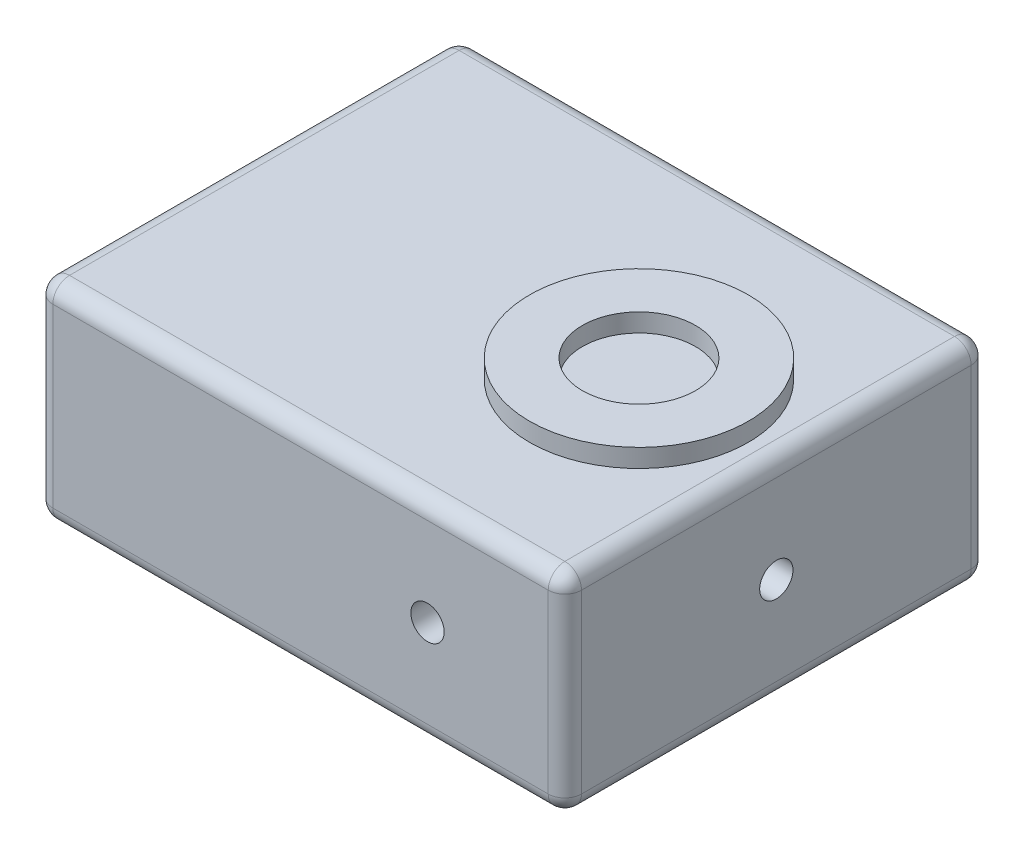
ISO-10303-21;
HEADER;
FILE_DESCRIPTION(('STEP AP214'),'2;1');
FILE_NAME('part.step','',(''),(''),'','','');
FILE_SCHEMA(('AUTOMOTIVE_DESIGN { 1 0 10303 214 1 1 1 1 }'));
ENDSEC;
DATA;
#1=APPLICATION_CONTEXT('core data for automotive mechanical design processes');
#2=APPLICATION_PROTOCOL_DEFINITION('international standard','automotive_design',2000,#1);
#3=PRODUCT_CONTEXT('',#1,'mechanical');
#4=PRODUCT('Part','Part','',(#3));
#5=PRODUCT_RELATED_PRODUCT_CATEGORY('part','',(#4));
#6=PRODUCT_DEFINITION_FORMATION('','',#4);
#7=PRODUCT_DEFINITION_CONTEXT('part definition',#1,'design');
#8=PRODUCT_DEFINITION('design','',#6,#7);
#9=PRODUCT_DEFINITION_SHAPE('','',#8);
#10=(LENGTH_UNIT() NAMED_UNIT(*) SI_UNIT(.MILLI.,.METRE.));
#11=(NAMED_UNIT(*) PLANE_ANGLE_UNIT() SI_UNIT($,.RADIAN.));
#12=(NAMED_UNIT(*) SI_UNIT($,.STERADIAN.) SOLID_ANGLE_UNIT());
#13=UNCERTAINTY_MEASURE_WITH_UNIT(LENGTH_MEASURE(1.E-05),#10,'distance_accuracy_value','');
#14=(GEOMETRIC_REPRESENTATION_CONTEXT(3) GLOBAL_UNCERTAINTY_ASSIGNED_CONTEXT((#13)) GLOBAL_UNIT_ASSIGNED_CONTEXT((#10,
#11,#12)) REPRESENTATION_CONTEXT('',''));
#15=CARTESIAN_POINT('',(0.,0.,0.));
#16=DIRECTION('',(0.,0.,1.));
#17=DIRECTION('',(1.,0.,0.));
#18=AXIS2_PLACEMENT_3D('',#15,#16,#17);
#19=CARTESIAN_POINT('',(-31.75,25.2,-25.4));
#20=DIRECTION('',(0.,0.,1.));
#21=DIRECTION('',(1.,0.,0.));
#22=AXIS2_PLACEMENT_3D('',#19,#20,#21);
#23=PLANE('',#22);
#24=CARTESIAN_POINT('',(15.25,12.6,-25.4));
#25=DIRECTION('',(0.,0.,-1.));
#26=DIRECTION('',(-1.,0.,0.));
#27=AXIS2_PLACEMENT_3D('',#24,#25,#26);
#28=CIRCLE('',#27,2.);
#29=CARTESIAN_POINT('',(13.25,12.6,-25.4));
#30=VERTEX_POINT('',#29);
#31=EDGE_CURVE('E195',#30,#30,#28,.T.);
#32=ORIENTED_EDGE('',*,*,#31,.F.);
#33=EDGE_LOOP('',(#32));
#34=FACE_BOUND('',#33,.T.);
#35=DIRECTION('',(-1.,0.,0.));
#36=VECTOR('',#35,1.);
#37=CARTESIAN_POINT('',(-31.75,2.,-25.4));
#38=LINE('',#37,#36);
#39=CARTESIAN_POINT('',(29.75,2.,-25.4));
#40=VERTEX_POINT('',#39);
#41=CARTESIAN_POINT('',(-29.75,2.,-25.4));
#42=VERTEX_POINT('',#41);
#43=EDGE_CURVE('E243',#40,#42,#38,.T.);
#44=ORIENTED_EDGE('',*,*,#43,.T.);
#45=DIRECTION('',(0.,-1.,0.));
#46=VECTOR('',#45,1.);
#47=CARTESIAN_POINT('',(-29.75,25.2,-25.4));
#48=LINE('',#47,#46);
#49=CARTESIAN_POINT('',(-29.75,23.2,-25.4));
#50=VERTEX_POINT('',#49);
#51=EDGE_CURVE('E246',#42,#50,#48,.F.);
#52=ORIENTED_EDGE('',*,*,#51,.T.);
#53=DIRECTION('',(-1.,0.,0.));
#54=VECTOR('',#53,1.);
#55=CARTESIAN_POINT('',(-31.75,23.2,-25.4));
#56=LINE('',#55,#54);
#57=CARTESIAN_POINT('',(29.75,23.2,-25.4));
#58=VERTEX_POINT('',#57);
#59=EDGE_CURVE('E241',#50,#58,#56,.F.);
#60=ORIENTED_EDGE('',*,*,#59,.T.);
#61=DIRECTION('',(0.,-1.,0.));
#62=VECTOR('',#61,1.);
#63=CARTESIAN_POINT('',(29.75,25.2,-25.4));
#64=LINE('',#63,#62);
#65=EDGE_CURVE('E239',#58,#40,#64,.T.);
#66=ORIENTED_EDGE('',*,*,#65,.T.);
#67=EDGE_LOOP('',(#44,#52,#60,#66));
#68=FACE_BOUND('',#67,.T.);
#69=DIRECTION('',(0.,1.,0.));
#70=VECTOR('',#69,1.);
#71=CARTESIAN_POINT('',(-25.25,2.5,-25.4));
#72=LINE('',#71,#70);
#73=CARTESIAN_POINT('',(-25.25,2.5,-25.4));
#74=VERTEX_POINT('',#73);
#75=CARTESIAN_POINT('',(-25.25,14.5,-25.4));
#76=VERTEX_POINT('',#75);
#77=EDGE_CURVE('E182',#74,#76,#72,.T.);
#78=ORIENTED_EDGE('',*,*,#77,.F.);
#79=DIRECTION('',(-1.,0.,0.));
#80=VECTOR('',#79,1.);
#81=CARTESIAN_POINT('',(-7.25,2.5,-25.4));
#82=LINE('',#81,#80);
#83=CARTESIAN_POINT('',(-7.25,2.5,-25.4));
#84=VERTEX_POINT('',#83);
#85=EDGE_CURVE('E179',#84,#74,#82,.T.);
#86=ORIENTED_EDGE('',*,*,#85,.F.);
#87=DIRECTION('',(0.,-1.,0.));
#88=VECTOR('',#87,1.);
#89=CARTESIAN_POINT('',(-7.25,2.5,-25.4));
#90=LINE('',#89,#88);
#91=CARTESIAN_POINT('',(-7.25,14.5,-25.4));
#92=VERTEX_POINT('',#91);
#93=EDGE_CURVE('E69',#92,#84,#90,.T.);
#94=ORIENTED_EDGE('',*,*,#93,.F.);
#95=DIRECTION('',(1.,0.,0.));
#96=VECTOR('',#95,1.);
#97=CARTESIAN_POINT('',(-7.25,14.5,-25.4));
#98=LINE('',#97,#96);
#99=EDGE_CURVE('E64',#76,#92,#98,.T.);
#100=ORIENTED_EDGE('',*,*,#99,.F.);
#101=EDGE_LOOP('',(#78,#86,#94,#100));
#102=FACE_BOUND('',#101,.T.);
#103=ADVANCED_FACE('F47',(#34,#68,#102),#23,.F.);
#104=CARTESIAN_POINT('',(31.75,25.2,25.4));
#105=DIRECTION('',(-1.,0.,0.));
#106=DIRECTION('',(0.,0.,1.));
#107=AXIS2_PLACEMENT_3D('',#104,#105,#106);
#108=PLANE('',#107);
#109=DIRECTION('',(0.,-1.,0.));
#110=VECTOR('',#109,1.);
#111=CARTESIAN_POINT('',(31.75,25.2,23.4));
#112=LINE('',#111,#110);
#113=CARTESIAN_POINT('',(31.75,23.2,23.4));
#114=VERTEX_POINT('',#113);
#115=CARTESIAN_POINT('',(31.75,2.,23.4));
#116=VERTEX_POINT('',#115);
#117=EDGE_CURVE('E225',#114,#116,#112,.T.);
#118=ORIENTED_EDGE('',*,*,#117,.T.);
#119=DIRECTION('',(0.,0.,-1.));
#120=VECTOR('',#119,1.);
#121=CARTESIAN_POINT('',(31.75,2.,-25.4));
#122=LINE('',#121,#120);
#123=CARTESIAN_POINT('',(31.75,2.,-23.4));
#124=VERTEX_POINT('',#123);
#125=EDGE_CURVE('E227',#116,#124,#122,.T.);
#126=ORIENTED_EDGE('',*,*,#125,.T.);
#127=DIRECTION('',(0.,-1.,0.));
#128=VECTOR('',#127,1.);
#129=CARTESIAN_POINT('',(31.75,25.2,-23.4));
#130=LINE('',#129,#128);
#131=CARTESIAN_POINT('',(31.75,23.2,-23.4));
#132=VERTEX_POINT('',#131);
#133=EDGE_CURVE('E223',#124,#132,#130,.F.);
#134=ORIENTED_EDGE('',*,*,#133,.T.);
#135=DIRECTION('',(0.,0.,-1.));
#136=VECTOR('',#135,1.);
#137=CARTESIAN_POINT('',(31.75,23.2,25.4));
#138=LINE('',#137,#136);
#139=EDGE_CURVE('E221',#132,#114,#138,.F.);
#140=ORIENTED_EDGE('',*,*,#139,.T.);
#141=EDGE_LOOP('',(#118,#126,#134,#140));
#142=FACE_BOUND('',#141,.T.);
#143=CARTESIAN_POINT('',(31.75,12.6,0.));
#144=DIRECTION('',(1.,0.,0.));
#145=DIRECTION('',(0.,0.,-1.));
#146=AXIS2_PLACEMENT_3D('',#143,#144,#145);
#147=CIRCLE('',#146,2.);
#148=CARTESIAN_POINT('',(31.75,12.6,-2.));
#149=VERTEX_POINT('',#148);
#150=EDGE_CURVE('E194',#149,#149,#147,.T.);
#151=ORIENTED_EDGE('',*,*,#150,.F.);
#152=EDGE_LOOP('',(#151));
#153=FACE_BOUND('',#152,.T.);
#154=ADVANCED_FACE('F416',(#142,#153),#108,.F.);
#155=CARTESIAN_POINT('',(-31.75,25.2,25.4));
#156=DIRECTION('',(1.,0.,0.));
#157=DIRECTION('',(0.,0.,-1.));
#158=AXIS2_PLACEMENT_3D('',#155,#156,#157);
#159=PLANE('',#158);
#160=DIRECTION('',(0.,0.,1.));
#161=VECTOR('',#160,1.);
#162=CARTESIAN_POINT('',(-31.75,2.,25.4));
#163=LINE('',#162,#161);
#164=CARTESIAN_POINT('',(-31.75,2.,-23.4));
#165=VERTEX_POINT('',#164);
#166=CARTESIAN_POINT('',(-31.75,2.,23.4));
#167=VERTEX_POINT('',#166);
#168=EDGE_CURVE('E252',#165,#167,#163,.T.);
#169=ORIENTED_EDGE('',*,*,#168,.T.);
#170=DIRECTION('',(0.,-1.,0.));
#171=VECTOR('',#170,1.);
#172=CARTESIAN_POINT('',(-31.75,25.2,23.4));
#173=LINE('',#172,#171);
#174=CARTESIAN_POINT('',(-31.75,23.2,23.4));
#175=VERTEX_POINT('',#174);
#176=EDGE_CURVE('E255',#167,#175,#173,.F.);
#177=ORIENTED_EDGE('',*,*,#176,.T.);
#178=DIRECTION('',(0.,0.,1.));
#179=VECTOR('',#178,1.);
#180=CARTESIAN_POINT('',(-31.75,23.2,25.4));
#181=LINE('',#180,#179);
#182=CARTESIAN_POINT('',(-31.75,23.2,-23.4));
#183=VERTEX_POINT('',#182);
#184=EDGE_CURVE('E250',#175,#183,#181,.F.);
#185=ORIENTED_EDGE('',*,*,#184,.T.);
#186=DIRECTION('',(0.,-1.,0.));
#187=VECTOR('',#186,1.);
#188=CARTESIAN_POINT('',(-31.75,25.2,-23.4));
#189=LINE('',#188,#187);
#190=EDGE_CURVE('E248',#183,#165,#189,.T.);
#191=ORIENTED_EDGE('',*,*,#190,.T.);
#192=EDGE_LOOP('',(#169,#177,#185,#191));
#193=FACE_BOUND('',#192,.T.);
#194=ADVANCED_FACE('F385',(#193),#159,.F.);
#195=CARTESIAN_POINT('',(-31.75,25.2,25.4));
#196=DIRECTION('',(0.,0.,-1.));
#197=DIRECTION('',(-1.,0.,0.));
#198=AXIS2_PLACEMENT_3D('',#195,#196,#197);
#199=PLANE('',#198);
#200=DIRECTION('',(1.,0.,0.));
#201=VECTOR('',#200,1.);
#202=CARTESIAN_POINT('',(31.75,2.,25.4));
#203=LINE('',#202,#201);
#204=CARTESIAN_POINT('',(-29.75,2.,25.4));
#205=VERTEX_POINT('',#204);
#206=CARTESIAN_POINT('',(29.75,2.,25.4));
#207=VERTEX_POINT('',#206);
#208=EDGE_CURVE('E261',#205,#207,#203,.T.);
#209=ORIENTED_EDGE('',*,*,#208,.T.);
#210=DIRECTION('',(0.,-1.,0.));
#211=VECTOR('',#210,1.);
#212=CARTESIAN_POINT('',(29.75,25.2,25.4));
#213=LINE('',#212,#211);
#214=CARTESIAN_POINT('',(29.75,23.2,25.4));
#215=VERTEX_POINT('',#214);
#216=EDGE_CURVE('E264',#207,#215,#213,.F.);
#217=ORIENTED_EDGE('',*,*,#216,.T.);
#218=DIRECTION('',(1.,0.,0.));
#219=VECTOR('',#218,1.);
#220=CARTESIAN_POINT('',(-31.75,23.2,25.4));
#221=LINE('',#220,#219);
#222=CARTESIAN_POINT('',(-29.75,23.2,25.4));
#223=VERTEX_POINT('',#222);
#224=EDGE_CURVE('E259',#215,#223,#221,.F.);
#225=ORIENTED_EDGE('',*,*,#224,.T.);
#226=DIRECTION('',(0.,-1.,0.));
#227=VECTOR('',#226,1.);
#228=CARTESIAN_POINT('',(-29.75,25.2,25.4));
#229=LINE('',#228,#227);
#230=EDGE_CURVE('E257',#223,#205,#229,.T.);
#231=ORIENTED_EDGE('',*,*,#230,.T.);
#232=EDGE_LOOP('',(#209,#217,#225,#231));
#233=FACE_BOUND('',#232,.T.);
#234=CARTESIAN_POINT('',(15.25,12.6,25.4));
#235=DIRECTION('',(0.,0.,1.));
#236=DIRECTION('',(1.,0.,0.));
#237=AXIS2_PLACEMENT_3D('',#234,#235,#236);
#238=CIRCLE('',#237,2.);
#239=CARTESIAN_POINT('',(17.25,12.6,25.4));
#240=VERTEX_POINT('',#239);
#241=EDGE_CURVE('E201',#240,#240,#238,.T.);
#242=ORIENTED_EDGE('',*,*,#241,.F.);
#243=EDGE_LOOP('',(#242));
#244=FACE_BOUND('',#243,.T.);
#245=ADVANCED_FACE('F350',(#233,#244),#199,.F.);
#246=CARTESIAN_POINT('',(0.,25.2,0.));
#247=DIRECTION('',(0.,-1.,0.));
#248=DIRECTION('',(0.,0.,-1.));
#249=AXIS2_PLACEMENT_3D('',#246,#247,#248);
#250=PLANE('',#249);
#251=DIRECTION('',(0.,0.,-1.));
#252=VECTOR('',#251,1.);
#253=CARTESIAN_POINT('',(29.75,25.2,0.));
#254=LINE('',#253,#252);
#255=CARTESIAN_POINT('',(29.75,25.2,23.4));
#256=VERTEX_POINT('',#255);
#257=CARTESIAN_POINT('',(29.75,25.2,-23.4));
#258=VERTEX_POINT('',#257);
#259=EDGE_CURVE('E266',#256,#258,#254,.T.);
#260=ORIENTED_EDGE('',*,*,#259,.T.);
#261=DIRECTION('',(-1.,0.,0.));
#262=VECTOR('',#261,1.);
#263=CARTESIAN_POINT('',(0.,25.2,-23.4));
#264=LINE('',#263,#262);
#265=CARTESIAN_POINT('',(-29.75,25.2,-23.4));
#266=VERTEX_POINT('',#265);
#267=EDGE_CURVE('E13',#258,#266,#264,.T.);
#268=ORIENTED_EDGE('',*,*,#267,.T.);
#269=DIRECTION('',(0.,0.,1.));
#270=VECTOR('',#269,1.);
#271=CARTESIAN_POINT('',(-29.75,25.2,0.));
#272=LINE('',#271,#270);
#273=CARTESIAN_POINT('',(-29.75,25.2,23.4));
#274=VERTEX_POINT('',#273);
#275=EDGE_CURVE('E56',#266,#274,#272,.T.);
#276=ORIENTED_EDGE('',*,*,#275,.T.);
#277=DIRECTION('',(1.,0.,0.));
#278=VECTOR('',#277,1.);
#279=CARTESIAN_POINT('',(0.,25.2,23.4));
#280=LINE('',#279,#278);
#281=EDGE_CURVE('E268',#274,#256,#280,.T.);
#282=ORIENTED_EDGE('',*,*,#281,.T.);
#283=EDGE_LOOP('',(#260,#268,#276,#282));
#284=FACE_BOUND('',#283,.T.);
#285=CARTESIAN_POINT('',(15.25,25.2,0.));
#286=DIRECTION('',(0.,-1.,0.));
#287=DIRECTION('',(0.,0.,-1.));
#288=AXIS2_PLACEMENT_3D('',#285,#286,#287);
#289=CIRCLE('',#288,13.1445);
#290=CARTESIAN_POINT('',(15.25,25.2,-13.1445));
#291=VERTEX_POINT('',#290);
#292=EDGE_CURVE('E218',#291,#291,#289,.F.);
#293=ORIENTED_EDGE('',*,*,#292,.F.);
#294=EDGE_LOOP('',(#293));
#295=FACE_BOUND('',#294,.T.);
#296=ADVANCED_FACE('F360',(#284,#295),#250,.F.);
#297=CARTESIAN_POINT('',(0.,0.,0.));
#298=DIRECTION('',(0.,-1.,0.));
#299=DIRECTION('',(0.,0.,-1.));
#300=AXIS2_PLACEMENT_3D('',#297,#298,#299);
#301=PLANE('',#300);
#302=DIRECTION('',(-1.,0.,0.));
#303=VECTOR('',#302,1.);
#304=CARTESIAN_POINT('',(31.75,0.,-23.4));
#305=LINE('',#304,#303);
#306=CARTESIAN_POINT('',(-29.75,0.,-23.4));
#307=VERTEX_POINT('',#306);
#308=CARTESIAN_POINT('',(29.75,0.,-23.4));
#309=VERTEX_POINT('',#308);
#310=EDGE_CURVE('E234',#307,#309,#305,.F.);
#311=ORIENTED_EDGE('',*,*,#310,.T.);
#312=DIRECTION('',(0.,0.,-1.));
#313=VECTOR('',#312,1.);
#314=CARTESIAN_POINT('',(29.75,0.,25.4));
#315=LINE('',#314,#313);
#316=CARTESIAN_POINT('',(29.75,0.,23.4));
#317=VERTEX_POINT('',#316);
#318=EDGE_CURVE('E236',#309,#317,#315,.F.);
#319=ORIENTED_EDGE('',*,*,#318,.T.);
#320=DIRECTION('',(1.,0.,0.));
#321=VECTOR('',#320,1.);
#322=CARTESIAN_POINT('',(-31.75,0.,23.4));
#323=LINE('',#322,#321);
#324=CARTESIAN_POINT('',(-29.75,0.,23.4));
#325=VERTEX_POINT('',#324);
#326=EDGE_CURVE('E230',#317,#325,#323,.F.);
#327=ORIENTED_EDGE('',*,*,#326,.T.);
#328=DIRECTION('',(0.,0.,1.));
#329=VECTOR('',#328,1.);
#330=CARTESIAN_POINT('',(-29.75,0.,-25.4));
#331=LINE('',#330,#329);
#332=EDGE_CURVE('E232',#325,#307,#331,.F.);
#333=ORIENTED_EDGE('',*,*,#332,.T.);
#334=EDGE_LOOP('',(#311,#319,#327,#333));
#335=FACE_BOUND('',#334,.T.);
#336=ADVANCED_FACE('F461',(#335),#301,.T.);
#337=CARTESIAN_POINT('',(15.25,27.4,0.));
#338=DIRECTION('',(0.,1.,0.));
#339=DIRECTION('',(0.,0.,1.));
#340=AXIS2_PLACEMENT_3D('',#337,#338,#339);
#341=PLANE('',#340);
#342=CARTESIAN_POINT('',(15.25,27.4,0.));
#343=DIRECTION('',(0.,1.,0.));
#344=DIRECTION('',(0.,0.,1.));
#345=AXIS2_PLACEMENT_3D('',#342,#343,#344);
#346=CIRCLE('',#345,13.1445);
#347=CARTESIAN_POINT('',(15.25,27.4,13.1445));
#348=VERTEX_POINT('',#347);
#349=EDGE_CURVE('E213',#348,#348,#346,.T.);
#350=ORIENTED_EDGE('',*,*,#349,.T.);
#351=EDGE_LOOP('',(#350));
#352=FACE_BOUND('',#351,.T.);
#353=CARTESIAN_POINT('',(15.25,27.4,0.));
#354=DIRECTION('',(0.,1.,0.));
#355=DIRECTION('',(0.,0.,1.));
#356=AXIS2_PLACEMENT_3D('',#353,#354,#355);
#357=CIRCLE('',#356,6.7945);
#358=CARTESIAN_POINT('',(15.25,27.4,6.7945));
#359=VERTEX_POINT('',#358);
#360=EDGE_CURVE('E210',#359,#359,#357,.T.);
#361=ORIENTED_EDGE('',*,*,#360,.F.);
#362=EDGE_LOOP('',(#361));
#363=FACE_BOUND('',#362,.T.);
#364=ADVANCED_FACE('F497',(#352,#363),#341,.T.);
#365=CARTESIAN_POINT('',(15.25,27.4,0.));
#366=DIRECTION('',(0.,-1.,0.));
#367=DIRECTION('',(0.,0.,-1.));
#368=AXIS2_PLACEMENT_3D('',#365,#366,#367);
#369=CYLINDRICAL_SURFACE('',#368,13.1445);
#370=ORIENTED_EDGE('',*,*,#349,.F.);
#371=EDGE_LOOP('',(#370));
#372=FACE_BOUND('',#371,.T.);
#373=ORIENTED_EDGE('',*,*,#292,.T.);
#374=EDGE_LOOP('',(#373));
#375=FACE_BOUND('',#374,.T.);
#376=ADVANCED_FACE('F495',(#372,#375),#369,.T.);
#377=CARTESIAN_POINT('',(15.25,27.4,0.));
#378=DIRECTION('',(0.,-1.,0.));
#379=DIRECTION('',(0.,0.,-1.));
#380=AXIS2_PLACEMENT_3D('',#377,#378,#379);
#381=CYLINDRICAL_SURFACE('',#380,6.7945);
#382=ORIENTED_EDGE('',*,*,#360,.T.);
#383=EDGE_LOOP('',(#382));
#384=FACE_BOUND('',#383,.T.);
#385=CARTESIAN_POINT('',(15.25,25.2,0.));
#386=DIRECTION('',(0.,1.,0.));
#387=DIRECTION('',(0.,0.,1.));
#388=AXIS2_PLACEMENT_3D('',#385,#386,#387);
#389=CIRCLE('',#388,6.7945);
#390=CARTESIAN_POINT('',(15.25,25.2,6.7945));
#391=VERTEX_POINT('',#390);
#392=EDGE_CURVE('E207',#391,#391,#389,.T.);
#393=ORIENTED_EDGE('',*,*,#392,.F.);
#394=EDGE_LOOP('',(#393));
#395=FACE_BOUND('',#394,.T.);
#396=ADVANCED_FACE('F492',(#384,#395),#381,.F.);
#397=ORIENTED_EDGE('',*,*,#392,.T.);
#398=EDGE_LOOP('',(#397));
#399=FACE_BOUND('',#398,.T.);
#400=ADVANCED_FACE('F490',(#399),#250,.F.);
#401=CARTESIAN_POINT('',(15.25,12.6,19.9));
#402=DIRECTION('',(0.,0.,1.));
#403=DIRECTION('',(1.,0.,0.));
#404=AXIS2_PLACEMENT_3D('',#401,#402,#403);
#405=CYLINDRICAL_SURFACE('',#404,2.);
#406=CARTESIAN_POINT('',(15.25,12.6,19.9));
#407=DIRECTION('',(0.,0.,1.));
#408=DIRECTION('',(1.,0.,0.));
#409=AXIS2_PLACEMENT_3D('',#406,#407,#408);
#410=CIRCLE('',#409,2.);
#411=CARTESIAN_POINT('',(17.25,12.6,19.9));
#412=VERTEX_POINT('',#411);
#413=EDGE_CURVE('E204',#412,#412,#410,.T.);
#414=ORIENTED_EDGE('',*,*,#413,.F.);
#415=EDGE_LOOP('',(#414));
#416=FACE_BOUND('',#415,.T.);
#417=ORIENTED_EDGE('',*,*,#241,.T.);
#418=EDGE_LOOP('',(#417));
#419=FACE_BOUND('',#418,.T.);
#420=ADVANCED_FACE('F482',(#416,#419),#405,.F.);
#421=CARTESIAN_POINT('',(15.25,12.6,19.9));
#422=DIRECTION('',(0.,0.,1.));
#423=DIRECTION('',(1.,0.,0.));
#424=AXIS2_PLACEMENT_3D('',#421,#422,#423);
#425=PLANE('',#424);
#426=ORIENTED_EDGE('',*,*,#413,.T.);
#427=EDGE_LOOP('',(#426));
#428=FACE_BOUND('',#427,.T.);
#429=ADVANCED_FACE('F472',(#428),#425,.T.);
#430=CARTESIAN_POINT('',(26.25,12.6,0.));
#431=DIRECTION('',(1.,0.,0.));
#432=DIRECTION('',(0.,0.,-1.));
#433=AXIS2_PLACEMENT_3D('',#430,#431,#432);
#434=CYLINDRICAL_SURFACE('',#433,2.);
#435=CARTESIAN_POINT('',(26.25,12.6,0.));
#436=DIRECTION('',(1.,0.,0.));
#437=DIRECTION('',(0.,0.,-1.));
#438=AXIS2_PLACEMENT_3D('',#435,#436,#437);
#439=CIRCLE('',#438,2.);
#440=CARTESIAN_POINT('',(26.25,12.6,-2.));
#441=VERTEX_POINT('',#440);
#442=EDGE_CURVE('E198',#441,#441,#439,.T.);
#443=ORIENTED_EDGE('',*,*,#442,.F.);
#444=EDGE_LOOP('',(#443));
#445=FACE_BOUND('',#444,.T.);
#446=ORIENTED_EDGE('',*,*,#150,.T.);
#447=EDGE_LOOP('',(#446));
#448=FACE_BOUND('',#447,.T.);
#449=ADVANCED_FACE('F469',(#445,#448),#434,.F.);
#450=CARTESIAN_POINT('',(26.25,12.6,0.));
#451=DIRECTION('',(1.,0.,0.));
#452=DIRECTION('',(0.,0.,-1.));
#453=AXIS2_PLACEMENT_3D('',#450,#451,#452);
#454=PLANE('',#453);
#455=ORIENTED_EDGE('',*,*,#442,.T.);
#456=EDGE_LOOP('',(#455));
#457=FACE_BOUND('',#456,.T.);
#458=ADVANCED_FACE('F471',(#457),#454,.T.);
#459=CARTESIAN_POINT('',(15.25,12.6,-19.9));
#460=DIRECTION('',(0.,0.,-1.));
#461=DIRECTION('',(-1.,0.,0.));
#462=AXIS2_PLACEMENT_3D('',#459,#460,#461);
#463=CYLINDRICAL_SURFACE('',#462,2.);
#464=CARTESIAN_POINT('',(15.25,12.6,-19.9));
#465=DIRECTION('',(0.,0.,-1.));
#466=DIRECTION('',(-1.,0.,0.));
#467=AXIS2_PLACEMENT_3D('',#464,#465,#466);
#468=CIRCLE('',#467,2.);
#469=CARTESIAN_POINT('',(13.25,12.6,-19.9));
#470=VERTEX_POINT('',#469);
#471=EDGE_CURVE('E191',#470,#470,#468,.T.);
#472=ORIENTED_EDGE('',*,*,#471,.F.);
#473=EDGE_LOOP('',(#472));
#474=FACE_BOUND('',#473,.T.);
#475=ORIENTED_EDGE('',*,*,#31,.T.);
#476=EDGE_LOOP('',(#475));
#477=FACE_BOUND('',#476,.T.);
#478=ADVANCED_FACE('F479',(#474,#477),#463,.F.);
#479=CARTESIAN_POINT('',(15.25,12.6,-19.9));
#480=DIRECTION('',(0.,0.,-1.));
#481=DIRECTION('',(-1.,0.,0.));
#482=AXIS2_PLACEMENT_3D('',#479,#480,#481);
#483=PLANE('',#482);
#484=ORIENTED_EDGE('',*,*,#471,.T.);
#485=EDGE_LOOP('',(#484));
#486=FACE_BOUND('',#485,.T.);
#487=ADVANCED_FACE('F522',(#486),#483,.T.);
#488=CARTESIAN_POINT('',(-29.75,23.2,0.));
#489=DIRECTION('',(0.,0.,1.));
#490=DIRECTION('',(1.,0.,0.));
#491=AXIS2_PLACEMENT_3D('',#488,#489,#490);
#492=CYLINDRICAL_SURFACE('',#491,2.);
#493=CARTESIAN_POINT('',(-29.75,23.2,23.4));
#494=DIRECTION('',(0.,0.,1.));
#495=DIRECTION('',(1.,0.,0.));
#496=AXIS2_PLACEMENT_3D('',#493,#494,#495);
#497=CIRCLE('',#496,2.);
#498=EDGE_CURVE('E51',#274,#175,#497,.T.);
#499=ORIENTED_EDGE('',*,*,#498,.F.);
#500=ORIENTED_EDGE('',*,*,#275,.F.);
#501=CARTESIAN_POINT('',(-29.75,23.2,-23.4));
#502=DIRECTION('',(0.,0.,-1.));
#503=DIRECTION('',(-1.,0.,0.));
#504=AXIS2_PLACEMENT_3D('',#501,#502,#503);
#505=CIRCLE('',#504,2.);
#506=EDGE_CURVE('E327',#183,#266,#505,.T.);
#507=ORIENTED_EDGE('',*,*,#506,.F.);
#508=ORIENTED_EDGE('',*,*,#184,.F.);
#509=EDGE_LOOP('',(#499,#500,#507,#508));
#510=FACE_BOUND('',#509,.T.);
#511=ADVANCED_FACE('F49',(#510),#492,.T.);
#512=CARTESIAN_POINT('',(-29.75,23.2,23.4));
#513=DIRECTION('',(0.,0.,1.));
#514=DIRECTION('',(1.,0.,0.));
#515=AXIS2_PLACEMENT_3D('',#512,#513,#514);
#516=SPHERICAL_SURFACE('',#515,2.);
#517=CARTESIAN_POINT('',(-29.75,23.2,23.4));
#518=DIRECTION('',(-1.,0.,0.));
#519=DIRECTION('',(0.,0.,1.));
#520=AXIS2_PLACEMENT_3D('',#517,#518,#519);
#521=CIRCLE('',#520,2.);
#522=EDGE_CURVE('E322',#274,#223,#521,.F.);
#523=ORIENTED_EDGE('',*,*,#522,.F.);
#524=ORIENTED_EDGE('',*,*,#498,.T.);
#525=CARTESIAN_POINT('',(-29.75,23.2,23.4));
#526=DIRECTION('',(0.,1.,0.));
#527=DIRECTION('',(0.,0.,1.));
#528=AXIS2_PLACEMENT_3D('',#525,#526,#527);
#529=CIRCLE('',#528,2.);
#530=EDGE_CURVE('E325',#223,#175,#529,.F.);
#531=ORIENTED_EDGE('',*,*,#530,.F.);
#532=EDGE_LOOP('',(#523,#524,#531));
#533=FACE_BOUND('',#532,.T.);
#534=ADVANCED_FACE('F339',(#533),#516,.T.);
#535=CARTESIAN_POINT('',(-29.75,23.2,-23.4));
#536=DIRECTION('',(0.,0.,1.));
#537=DIRECTION('',(1.,0.,0.));
#538=AXIS2_PLACEMENT_3D('',#535,#536,#537);
#539=SPHERICAL_SURFACE('',#538,2.);
#540=CARTESIAN_POINT('',(-29.75,23.2,-23.4));
#541=DIRECTION('',(0.,1.,0.));
#542=DIRECTION('',(0.,0.,1.));
#543=AXIS2_PLACEMENT_3D('',#540,#541,#542);
#544=CIRCLE('',#543,2.);
#545=EDGE_CURVE('E317',#183,#50,#544,.F.);
#546=ORIENTED_EDGE('',*,*,#545,.F.);
#547=ORIENTED_EDGE('',*,*,#506,.T.);
#548=CARTESIAN_POINT('',(-29.75,23.2,-23.4));
#549=DIRECTION('',(-1.,0.,0.));
#550=DIRECTION('',(0.,0.,1.));
#551=AXIS2_PLACEMENT_3D('',#548,#549,#550);
#552=CIRCLE('',#551,2.);
#553=EDGE_CURVE('E320',#50,#266,#552,.F.);
#554=ORIENTED_EDGE('',*,*,#553,.F.);
#555=EDGE_LOOP('',(#546,#547,#554));
#556=FACE_BOUND('',#555,.T.);
#557=ADVANCED_FACE('F377',(#556),#539,.T.);
#558=CARTESIAN_POINT('',(-29.75,25.2,23.4));
#559=DIRECTION('',(0.,-1.,0.));
#560=DIRECTION('',(0.,0.,-1.));
#561=AXIS2_PLACEMENT_3D('',#558,#559,#560);
#562=CYLINDRICAL_SURFACE('',#561,2.);
#563=ORIENTED_EDGE('',*,*,#530,.T.);
#564=ORIENTED_EDGE('',*,*,#176,.F.);
#565=CARTESIAN_POINT('',(-29.75,2.,23.4));
#566=DIRECTION('',(0.,-1.,0.));
#567=DIRECTION('',(0.,0.,-1.));
#568=AXIS2_PLACEMENT_3D('',#565,#566,#567);
#569=CIRCLE('',#568,2.);
#570=EDGE_CURVE('E312',#205,#167,#569,.T.);
#571=ORIENTED_EDGE('',*,*,#570,.F.);
#572=ORIENTED_EDGE('',*,*,#230,.F.);
#573=EDGE_LOOP('',(#563,#564,#571,#572));
#574=FACE_BOUND('',#573,.T.);
#575=ADVANCED_FACE('F346',(#574),#562,.T.);
#576=CARTESIAN_POINT('',(0.,23.2,23.4));
#577=DIRECTION('',(1.,0.,0.));
#578=DIRECTION('',(0.,0.,-1.));
#579=AXIS2_PLACEMENT_3D('',#576,#577,#578);
#580=CYLINDRICAL_SURFACE('',#579,2.);
#581=ORIENTED_EDGE('',*,*,#522,.T.);
#582=ORIENTED_EDGE('',*,*,#224,.F.);
#583=CARTESIAN_POINT('',(29.75,23.2,23.4));
#584=DIRECTION('',(1.,0.,0.));
#585=DIRECTION('',(0.,0.,-1.));
#586=AXIS2_PLACEMENT_3D('',#583,#584,#585);
#587=CIRCLE('',#586,2.);
#588=EDGE_CURVE('E309',#256,#215,#587,.T.);
#589=ORIENTED_EDGE('',*,*,#588,.F.);
#590=ORIENTED_EDGE('',*,*,#281,.F.);
#591=EDGE_LOOP('',(#581,#582,#589,#590));
#592=FACE_BOUND('',#591,.T.);
#593=ADVANCED_FACE('F357',(#592),#580,.T.);
#594=CARTESIAN_POINT('',(29.75,23.2,0.));
#595=DIRECTION('',(0.,0.,-1.));
#596=DIRECTION('',(-1.,0.,0.));
#597=AXIS2_PLACEMENT_3D('',#594,#595,#596);
#598=CYLINDRICAL_SURFACE('',#597,2.);
#599=CARTESIAN_POINT('',(29.75,23.2,-23.4));
#600=DIRECTION('',(0.,0.,-1.));
#601=DIRECTION('',(-1.,0.,0.));
#602=AXIS2_PLACEMENT_3D('',#599,#600,#601);
#603=CIRCLE('',#602,2.);
#604=EDGE_CURVE('E303',#258,#132,#603,.T.);
#605=ORIENTED_EDGE('',*,*,#604,.F.);
#606=ORIENTED_EDGE('',*,*,#259,.F.);
#607=CARTESIAN_POINT('',(29.75,23.2,23.4));
#608=DIRECTION('',(0.,0.,1.));
#609=DIRECTION('',(1.,0.,0.));
#610=AXIS2_PLACEMENT_3D('',#607,#608,#609);
#611=CIRCLE('',#610,2.);
#612=EDGE_CURVE('E306',#114,#256,#611,.T.);
#613=ORIENTED_EDGE('',*,*,#612,.F.);
#614=ORIENTED_EDGE('',*,*,#139,.F.);
#615=EDGE_LOOP('',(#605,#606,#613,#614));
#616=FACE_BOUND('',#615,.T.);
#617=ADVANCED_FACE('F366',(#616),#598,.T.);
#618=CARTESIAN_POINT('',(0.,23.2,-23.4));
#619=DIRECTION('',(-1.,0.,0.));
#620=DIRECTION('',(0.,0.,1.));
#621=AXIS2_PLACEMENT_3D('',#618,#619,#620);
#622=CYLINDRICAL_SURFACE('',#621,2.);
#623=ORIENTED_EDGE('',*,*,#553,.T.);
#624=ORIENTED_EDGE('',*,*,#267,.F.);
#625=CARTESIAN_POINT('',(29.75,23.2,-23.4));
#626=DIRECTION('',(1.,0.,0.));
#627=DIRECTION('',(0.,0.,-1.));
#628=AXIS2_PLACEMENT_3D('',#625,#626,#627);
#629=CIRCLE('',#628,2.);
#630=EDGE_CURVE('E300',#58,#258,#629,.T.);
#631=ORIENTED_EDGE('',*,*,#630,.F.);
#632=ORIENTED_EDGE('',*,*,#59,.F.);
#633=EDGE_LOOP('',(#623,#624,#631,#632));
#634=FACE_BOUND('',#633,.T.);
#635=ADVANCED_FACE('F376',(#634),#622,.T.);
#636=CARTESIAN_POINT('',(-29.75,25.2,-23.4));
#637=DIRECTION('',(0.,-1.,0.));
#638=DIRECTION('',(0.,0.,-1.));
#639=AXIS2_PLACEMENT_3D('',#636,#637,#638);
#640=CYLINDRICAL_SURFACE('',#639,2.);
#641=ORIENTED_EDGE('',*,*,#545,.T.);
#642=ORIENTED_EDGE('',*,*,#51,.F.);
#643=CARTESIAN_POINT('',(-29.75,2.,-23.4));
#644=DIRECTION('',(0.,-1.,0.));
#645=DIRECTION('',(0.,0.,-1.));
#646=AXIS2_PLACEMENT_3D('',#643,#644,#645);
#647=CIRCLE('',#646,2.);
#648=EDGE_CURVE('E297',#165,#42,#647,.T.);
#649=ORIENTED_EDGE('',*,*,#648,.F.);
#650=ORIENTED_EDGE('',*,*,#190,.F.);
#651=EDGE_LOOP('',(#641,#642,#649,#650));
#652=FACE_BOUND('',#651,.T.);
#653=ADVANCED_FACE('F382',(#652),#640,.T.);
#654=CARTESIAN_POINT('',(-29.75,2.,25.4));
#655=DIRECTION('',(0.,0.,-1.));
#656=DIRECTION('',(-1.,0.,0.));
#657=AXIS2_PLACEMENT_3D('',#654,#655,#656);
#658=CYLINDRICAL_SURFACE('',#657,2.);
#659=CARTESIAN_POINT('',(-29.75,2.,23.4));
#660=DIRECTION('',(0.,0.,1.));
#661=DIRECTION('',(1.,0.,0.));
#662=AXIS2_PLACEMENT_3D('',#659,#660,#661);
#663=CIRCLE('',#662,2.);
#664=EDGE_CURVE('E314',#167,#325,#663,.T.);
#665=ORIENTED_EDGE('',*,*,#664,.F.);
#666=ORIENTED_EDGE('',*,*,#168,.F.);
#667=CARTESIAN_POINT('',(-29.75,2.,-23.4));
#668=DIRECTION('',(0.,0.,-1.));
#669=DIRECTION('',(-1.,0.,0.));
#670=AXIS2_PLACEMENT_3D('',#667,#668,#669);
#671=CIRCLE('',#670,2.);
#672=EDGE_CURVE('E294',#307,#165,#671,.T.);
#673=ORIENTED_EDGE('',*,*,#672,.F.);
#674=ORIENTED_EDGE('',*,*,#332,.F.);
#675=EDGE_LOOP('',(#665,#666,#673,#674));
#676=FACE_BOUND('',#675,.T.);
#677=ADVANCED_FACE('F389',(#676),#658,.T.);
#678=CARTESIAN_POINT('',(-29.75,2.,23.4));
#679=DIRECTION('',(0.,0.,1.));
#680=DIRECTION('',(1.,0.,0.));
#681=AXIS2_PLACEMENT_3D('',#678,#679,#680);
#682=SPHERICAL_SURFACE('',#681,2.);
#683=ORIENTED_EDGE('',*,*,#570,.T.);
#684=ORIENTED_EDGE('',*,*,#664,.T.);
#685=CARTESIAN_POINT('',(-29.75,2.,23.4));
#686=DIRECTION('',(-1.,0.,0.));
#687=DIRECTION('',(0.,0.,1.));
#688=AXIS2_PLACEMENT_3D('',#685,#686,#687);
#689=CIRCLE('',#688,2.);
#690=EDGE_CURVE('E291',#205,#325,#689,.F.);
#691=ORIENTED_EDGE('',*,*,#690,.F.);
#692=EDGE_LOOP('',(#683,#684,#691));
#693=FACE_BOUND('',#692,.T.);
#694=ADVANCED_FACE('F393',(#693),#682,.T.);
#695=CARTESIAN_POINT('',(29.75,23.2,23.4));
#696=DIRECTION('',(0.,0.,1.));
#697=DIRECTION('',(1.,0.,0.));
#698=AXIS2_PLACEMENT_3D('',#695,#696,#697);
#699=SPHERICAL_SURFACE('',#698,2.);
#700=ORIENTED_EDGE('',*,*,#612,.T.);
#701=ORIENTED_EDGE('',*,*,#588,.T.);
#702=CARTESIAN_POINT('',(29.75,23.2,23.4));
#703=DIRECTION('',(0.,1.,0.));
#704=DIRECTION('',(0.,0.,1.));
#705=AXIS2_PLACEMENT_3D('',#702,#703,#704);
#706=CIRCLE('',#705,2.);
#707=EDGE_CURVE('E288',#114,#215,#706,.F.);
#708=ORIENTED_EDGE('',*,*,#707,.F.);
#709=EDGE_LOOP('',(#700,#701,#708));
#710=FACE_BOUND('',#709,.T.);
#711=ADVANCED_FACE('F405',(#710),#699,.T.);
#712=CARTESIAN_POINT('',(29.75,23.2,-23.4));
#713=DIRECTION('',(0.,0.,1.));
#714=DIRECTION('',(1.,0.,0.));
#715=AXIS2_PLACEMENT_3D('',#712,#713,#714);
#716=SPHERICAL_SURFACE('',#715,2.);
#717=ORIENTED_EDGE('',*,*,#630,.T.);
#718=ORIENTED_EDGE('',*,*,#604,.T.);
#719=CARTESIAN_POINT('',(29.75,23.2,-23.4));
#720=DIRECTION('',(0.,1.,0.));
#721=DIRECTION('',(0.,0.,1.));
#722=AXIS2_PLACEMENT_3D('',#719,#720,#721);
#723=CIRCLE('',#722,2.);
#724=EDGE_CURVE('E285',#58,#132,#723,.F.);
#725=ORIENTED_EDGE('',*,*,#724,.F.);
#726=EDGE_LOOP('',(#717,#718,#725));
#727=FACE_BOUND('',#726,.T.);
#728=ADVANCED_FACE('F372',(#727),#716,.T.);
#729=CARTESIAN_POINT('',(-29.75,2.,-23.4));
#730=DIRECTION('',(0.,0.,1.));
#731=DIRECTION('',(1.,0.,0.));
#732=AXIS2_PLACEMENT_3D('',#729,#730,#731);
#733=SPHERICAL_SURFACE('',#732,2.);
#734=ORIENTED_EDGE('',*,*,#672,.T.);
#735=ORIENTED_EDGE('',*,*,#648,.T.);
#736=CARTESIAN_POINT('',(-29.75,2.,-23.4));
#737=DIRECTION('',(-1.,0.,0.));
#738=DIRECTION('',(0.,0.,1.));
#739=AXIS2_PLACEMENT_3D('',#736,#737,#738);
#740=CIRCLE('',#739,2.);
#741=EDGE_CURVE('E283',#307,#42,#740,.F.);
#742=ORIENTED_EDGE('',*,*,#741,.F.);
#743=EDGE_LOOP('',(#734,#735,#742));
#744=FACE_BOUND('',#743,.T.);
#745=ADVANCED_FACE('F412',(#744),#733,.T.);
#746=CARTESIAN_POINT('',(-31.75,2.,23.4));
#747=DIRECTION('',(-1.,0.,0.));
#748=DIRECTION('',(0.,0.,1.));
#749=AXIS2_PLACEMENT_3D('',#746,#747,#748);
#750=CYLINDRICAL_SURFACE('',#749,2.);
#751=ORIENTED_EDGE('',*,*,#690,.T.);
#752=ORIENTED_EDGE('',*,*,#326,.F.);
#753=CARTESIAN_POINT('',(29.75,2.,23.4));
#754=DIRECTION('',(1.,0.,0.));
#755=DIRECTION('',(0.,0.,-1.));
#756=AXIS2_PLACEMENT_3D('',#753,#754,#755);
#757=CIRCLE('',#756,2.);
#758=EDGE_CURVE('E280',#207,#317,#757,.T.);
#759=ORIENTED_EDGE('',*,*,#758,.F.);
#760=ORIENTED_EDGE('',*,*,#208,.F.);
#761=EDGE_LOOP('',(#751,#752,#759,#760));
#762=FACE_BOUND('',#761,.T.);
#763=ADVANCED_FACE('F396',(#762),#750,.T.);
#764=CARTESIAN_POINT('',(29.75,25.2,23.4));
#765=DIRECTION('',(0.,-1.,0.));
#766=DIRECTION('',(0.,0.,-1.));
#767=AXIS2_PLACEMENT_3D('',#764,#765,#766);
#768=CYLINDRICAL_SURFACE('',#767,2.);
#769=ORIENTED_EDGE('',*,*,#707,.T.);
#770=ORIENTED_EDGE('',*,*,#216,.F.);
#771=CARTESIAN_POINT('',(29.75,2.,23.4));
#772=DIRECTION('',(0.,-1.,0.));
#773=DIRECTION('',(0.,0.,-1.));
#774=AXIS2_PLACEMENT_3D('',#771,#772,#773);
#775=CIRCLE('',#774,2.);
#776=EDGE_CURVE('E278',#116,#207,#775,.T.);
#777=ORIENTED_EDGE('',*,*,#776,.F.);
#778=ORIENTED_EDGE('',*,*,#117,.F.);
#779=EDGE_LOOP('',(#769,#770,#777,#778));
#780=FACE_BOUND('',#779,.T.);
#781=ADVANCED_FACE('F402',(#780),#768,.T.);
#782=CARTESIAN_POINT('',(29.75,25.2,-23.4));
#783=DIRECTION('',(0.,-1.,0.));
#784=DIRECTION('',(0.,0.,-1.));
#785=AXIS2_PLACEMENT_3D('',#782,#783,#784);
#786=CYLINDRICAL_SURFACE('',#785,2.);
#787=ORIENTED_EDGE('',*,*,#724,.T.);
#788=ORIENTED_EDGE('',*,*,#133,.F.);
#789=CARTESIAN_POINT('',(29.75,2.,-23.4));
#790=DIRECTION('',(0.,-1.,0.));
#791=DIRECTION('',(0.,0.,-1.));
#792=AXIS2_PLACEMENT_3D('',#789,#790,#791);
#793=CIRCLE('',#792,2.);
#794=EDGE_CURVE('E275',#40,#124,#793,.T.);
#795=ORIENTED_EDGE('',*,*,#794,.F.);
#796=ORIENTED_EDGE('',*,*,#65,.F.);
#797=EDGE_LOOP('',(#787,#788,#795,#796));
#798=FACE_BOUND('',#797,.T.);
#799=ADVANCED_FACE('F443',(#798),#786,.T.);
#800=CARTESIAN_POINT('',(-31.75,2.,-23.4));
#801=DIRECTION('',(1.,0.,0.));
#802=DIRECTION('',(0.,0.,-1.));
#803=AXIS2_PLACEMENT_3D('',#800,#801,#802);
#804=CYLINDRICAL_SURFACE('',#803,2.);
#805=ORIENTED_EDGE('',*,*,#741,.T.);
#806=ORIENTED_EDGE('',*,*,#43,.F.);
#807=CARTESIAN_POINT('',(29.75,2.,-23.4));
#808=DIRECTION('',(1.,0.,0.));
#809=DIRECTION('',(0.,0.,-1.));
#810=AXIS2_PLACEMENT_3D('',#807,#808,#809);
#811=CIRCLE('',#810,2.);
#812=EDGE_CURVE('E272',#309,#40,#811,.T.);
#813=ORIENTED_EDGE('',*,*,#812,.F.);
#814=ORIENTED_EDGE('',*,*,#310,.F.);
#815=EDGE_LOOP('',(#805,#806,#813,#814));
#816=FACE_BOUND('',#815,.T.);
#817=ADVANCED_FACE('F440',(#816),#804,.T.);
#818=CARTESIAN_POINT('',(29.75,2.,23.4));
#819=DIRECTION('',(0.,0.,1.));
#820=DIRECTION('',(1.,0.,0.));
#821=AXIS2_PLACEMENT_3D('',#818,#819,#820);
#822=SPHERICAL_SURFACE('',#821,2.);
#823=ORIENTED_EDGE('',*,*,#776,.T.);
#824=ORIENTED_EDGE('',*,*,#758,.T.);
#825=CARTESIAN_POINT('',(29.75,2.,23.4));
#826=DIRECTION('',(0.,0.,1.));
#827=DIRECTION('',(1.,0.,0.));
#828=AXIS2_PLACEMENT_3D('',#825,#826,#827);
#829=CIRCLE('',#828,2.);
#830=EDGE_CURVE('E185',#116,#317,#829,.F.);
#831=ORIENTED_EDGE('',*,*,#830,.F.);
#832=EDGE_LOOP('',(#823,#824,#831));
#833=FACE_BOUND('',#832,.T.);
#834=ADVANCED_FACE('F436',(#833),#822,.T.);
#835=CARTESIAN_POINT('',(29.75,2.,-23.4));
#836=DIRECTION('',(0.,0.,1.));
#837=DIRECTION('',(1.,0.,0.));
#838=AXIS2_PLACEMENT_3D('',#835,#836,#837);
#839=SPHERICAL_SURFACE('',#838,2.);
#840=ORIENTED_EDGE('',*,*,#812,.T.);
#841=ORIENTED_EDGE('',*,*,#794,.T.);
#842=CARTESIAN_POINT('',(29.75,2.,-23.4));
#843=DIRECTION('',(0.,0.,-1.));
#844=DIRECTION('',(-1.,0.,0.));
#845=AXIS2_PLACEMENT_3D('',#842,#843,#844);
#846=CIRCLE('',#845,2.);
#847=EDGE_CURVE('E183',#309,#124,#846,.F.);
#848=ORIENTED_EDGE('',*,*,#847,.F.);
#849=EDGE_LOOP('',(#840,#841,#848));
#850=FACE_BOUND('',#849,.T.);
#851=ADVANCED_FACE('F432',(#850),#839,.T.);
#852=CARTESIAN_POINT('',(29.75,2.,25.4));
#853=DIRECTION('',(0.,0.,1.));
#854=DIRECTION('',(1.,0.,0.));
#855=AXIS2_PLACEMENT_3D('',#852,#853,#854);
#856=CYLINDRICAL_SURFACE('',#855,2.);
#857=ORIENTED_EDGE('',*,*,#830,.T.);
#858=ORIENTED_EDGE('',*,*,#318,.F.);
#859=ORIENTED_EDGE('',*,*,#847,.T.);
#860=ORIENTED_EDGE('',*,*,#125,.F.);
#861=EDGE_LOOP('',(#857,#858,#859,#860));
#862=FACE_BOUND('',#861,.T.);
#863=ADVANCED_FACE('F429',(#862),#856,.T.);
#864=CARTESIAN_POINT('',(-25.25,2.5,-26.4));
#865=DIRECTION('',(1.,0.,0.));
#866=DIRECTION('',(0.,0.,-1.));
#867=AXIS2_PLACEMENT_3D('',#864,#865,#866);
#868=PLANE('',#867);
#869=ORIENTED_EDGE('',*,*,#77,.T.);
#870=DIRECTION('',(0.,0.,1.));
#871=VECTOR('',#870,1.);
#872=CARTESIAN_POINT('',(-25.25,14.5,-26.4));
#873=LINE('',#872,#871);
#874=CARTESIAN_POINT('',(-25.25,14.5,-26.4));
#875=VERTEX_POINT('',#874);
#876=EDGE_CURVE('E163',#875,#76,#873,.T.);
#877=ORIENTED_EDGE('',*,*,#876,.F.);
#878=DIRECTION('',(0.,1.,0.));
#879=VECTOR('',#878,1.);
#880=CARTESIAN_POINT('',(-25.25,2.5,-26.4));
#881=LINE('',#880,#879);
#882=CARTESIAN_POINT('',(-25.25,2.5,-26.4));
#883=VERTEX_POINT('',#882);
#884=EDGE_CURVE('E170',#883,#875,#881,.T.);
#885=ORIENTED_EDGE('',*,*,#884,.F.);
#886=DIRECTION('',(0.,0.,1.));
#887=VECTOR('',#886,1.);
#888=CARTESIAN_POINT('',(-25.25,2.5,-26.4));
#889=LINE('',#888,#887);
#890=EDGE_CURVE('E787',#883,#74,#889,.T.);
#891=ORIENTED_EDGE('',*,*,#890,.T.);
#892=EDGE_LOOP('',(#869,#877,#885,#891));
#893=FACE_BOUND('',#892,.T.);
#894=ADVANCED_FACE('F181',(#893),#868,.F.);
#895=CARTESIAN_POINT('',(-7.25,14.5,-26.4));
#896=DIRECTION('',(0.,-1.,0.));
#897=DIRECTION('',(0.,0.,-1.));
#898=AXIS2_PLACEMENT_3D('',#895,#896,#897);
#899=PLANE('',#898);
#900=ORIENTED_EDGE('',*,*,#99,.T.);
#901=DIRECTION('',(0.,0.,1.));
#902=VECTOR('',#901,1.);
#903=CARTESIAN_POINT('',(-7.25,14.5,-26.4));
#904=LINE('',#903,#902);
#905=CARTESIAN_POINT('',(-7.25,14.5,-26.4));
#906=VERTEX_POINT('',#905);
#907=EDGE_CURVE('E166',#906,#92,#904,.T.);
#908=ORIENTED_EDGE('',*,*,#907,.F.);
#909=DIRECTION('',(1.,0.,0.));
#910=VECTOR('',#909,1.);
#911=CARTESIAN_POINT('',(-7.25,14.5,-26.4));
#912=LINE('',#911,#910);
#913=EDGE_CURVE('E159',#875,#906,#912,.T.);
#914=ORIENTED_EDGE('',*,*,#913,.F.);
#915=ORIENTED_EDGE('',*,*,#876,.T.);
#916=EDGE_LOOP('',(#900,#908,#914,#915));
#917=FACE_BOUND('',#916,.T.);
#918=ADVANCED_FACE('F161',(#917),#899,.F.);
#919=CARTESIAN_POINT('',(-7.25,2.5,-26.4));
#920=DIRECTION('',(-1.,0.,0.));
#921=DIRECTION('',(0.,0.,1.));
#922=AXIS2_PLACEMENT_3D('',#919,#920,#921);
#923=PLANE('',#922);
#924=ORIENTED_EDGE('',*,*,#93,.T.);
#925=DIRECTION('',(0.,0.,1.));
#926=VECTOR('',#925,1.);
#927=CARTESIAN_POINT('',(-7.25,2.5,-26.4));
#928=LINE('',#927,#926);
#929=CARTESIAN_POINT('',(-7.25,2.5,-26.4));
#930=VERTEX_POINT('',#929);
#931=EDGE_CURVE('E187',#930,#84,#928,.T.);
#932=ORIENTED_EDGE('',*,*,#931,.F.);
#933=DIRECTION('',(0.,-1.,0.));
#934=VECTOR('',#933,1.);
#935=CARTESIAN_POINT('',(-7.25,2.5,-26.4));
#936=LINE('',#935,#934);
#937=EDGE_CURVE('E169',#906,#930,#936,.T.);
#938=ORIENTED_EDGE('',*,*,#937,.F.);
#939=ORIENTED_EDGE('',*,*,#907,.T.);
#940=EDGE_LOOP('',(#924,#932,#938,#939));
#941=FACE_BOUND('',#940,.T.);
#942=ADVANCED_FACE('F754',(#941),#923,.F.);
#943=CARTESIAN_POINT('',(-7.25,2.5,-26.4));
#944=DIRECTION('',(0.,1.,0.));
#945=DIRECTION('',(0.,0.,1.));
#946=AXIS2_PLACEMENT_3D('',#943,#944,#945);
#947=PLANE('',#946);
#948=ORIENTED_EDGE('',*,*,#85,.T.);
#949=ORIENTED_EDGE('',*,*,#890,.F.);
#950=DIRECTION('',(-1.,0.,0.));
#951=VECTOR('',#950,1.);
#952=CARTESIAN_POINT('',(-7.25,2.5,-26.4));
#953=LINE('',#952,#951);
#954=EDGE_CURVE('E175',#930,#883,#953,.T.);
#955=ORIENTED_EDGE('',*,*,#954,.F.);
#956=ORIENTED_EDGE('',*,*,#931,.T.);
#957=EDGE_LOOP('',(#948,#949,#955,#956));
#958=FACE_BOUND('',#957,.T.);
#959=ADVANCED_FACE('F763',(#958),#947,.F.);
#960=CARTESIAN_POINT('',(0.,0.,-26.4));
#961=DIRECTION('',(0.,0.,1.));
#962=DIRECTION('',(1.,0.,0.));
#963=AXIS2_PLACEMENT_3D('',#960,#961,#962);
#964=PLANE('',#963);
#965=ORIENTED_EDGE('',*,*,#884,.T.);
#966=ORIENTED_EDGE('',*,*,#913,.T.);
#967=ORIENTED_EDGE('',*,*,#937,.T.);
#968=ORIENTED_EDGE('',*,*,#954,.T.);
#969=EDGE_LOOP('',(#965,#966,#967,#968));
#970=FACE_BOUND('',#969,.T.);
#971=ADVANCED_FACE('F173',(#970),#964,.F.);
#972=CLOSED_SHELL('',(#103,#154,#194,#245,#296,#336,#364,#376,#396,#400,#420,#429,#449,#458,
#478,#487,#511,#534,#557,#575,#593,#617,#635,#653,#677,#694,#711,#728,#745,#763,#781,#799,#817,
#834,#851,#863,#894,#918,#942,#959,#971));
#973=MANIFOLD_SOLID_BREP('B2',#972);
#974=ADVANCED_BREP_SHAPE_REPRESENTATION('',(#18,#973),#14);
#975=SHAPE_DEFINITION_REPRESENTATION(#9,#974);
ENDSEC;
END-ISO-10303-21;
